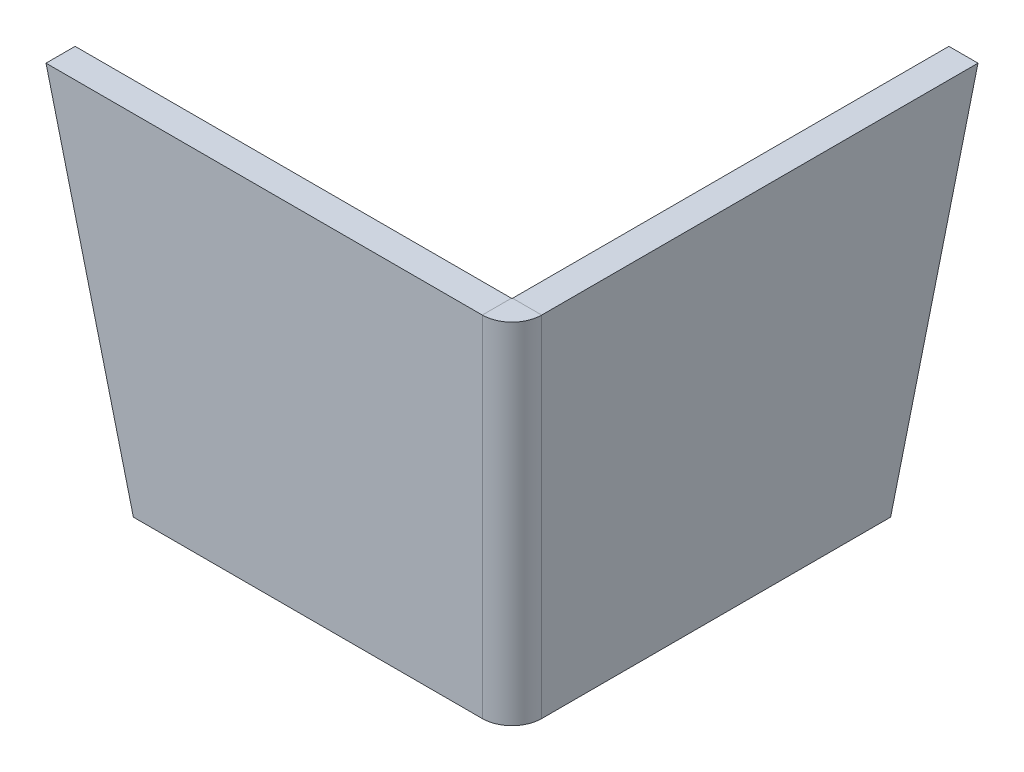
ISO-10303-21;
HEADER;
FILE_DESCRIPTION(('STEP AP214'),'2;1');
FILE_NAME('part.step','',(''),(''),'','','');
FILE_SCHEMA(('AUTOMOTIVE_DESIGN { 1 0 10303 214 1 1 1 1 }'));
ENDSEC;
DATA;
#1=APPLICATION_CONTEXT('core data for automotive mechanical design processes');
#2=APPLICATION_PROTOCOL_DEFINITION('international standard','automotive_design',2000,#1);
#3=PRODUCT_CONTEXT('',#1,'mechanical');
#4=PRODUCT('Part','Part','',(#3));
#5=PRODUCT_RELATED_PRODUCT_CATEGORY('part','',(#4));
#6=PRODUCT_DEFINITION_FORMATION('','',#4);
#7=PRODUCT_DEFINITION_CONTEXT('part definition',#1,'design');
#8=PRODUCT_DEFINITION('design','',#6,#7);
#9=PRODUCT_DEFINITION_SHAPE('','',#8);
#10=(LENGTH_UNIT() NAMED_UNIT(*) SI_UNIT(.MILLI.,.METRE.));
#11=(NAMED_UNIT(*) PLANE_ANGLE_UNIT() SI_UNIT($,.RADIAN.));
#12=(NAMED_UNIT(*) SI_UNIT($,.STERADIAN.) SOLID_ANGLE_UNIT());
#13=UNCERTAINTY_MEASURE_WITH_UNIT(LENGTH_MEASURE(1.E-05),#10,'distance_accuracy_value','');
#14=(GEOMETRIC_REPRESENTATION_CONTEXT(3) GLOBAL_UNCERTAINTY_ASSIGNED_CONTEXT((#13)) GLOBAL_UNIT_ASSIGNED_CONTEXT((#10,
#11,#12)) REPRESENTATION_CONTEXT('',''));
#15=CARTESIAN_POINT('',(0.,0.,0.));
#16=DIRECTION('',(0.,0.,1.));
#17=DIRECTION('',(1.,0.,0.));
#18=AXIS2_PLACEMENT_3D('',#15,#16,#17);
#19=CARTESIAN_POINT('',(-16.937594024725,-1.11022302462516E-13,420.));
#20=DIRECTION('',(0.,0.242535625036334,0.970142500145332));
#21=DIRECTION('',(0.,-0.970142500145336,0.242535625036333));
#22=AXIS2_PLACEMENT_3D('',#19,#20,#21);
#23=PLANE('',#22);
#24=DIRECTION('',(0.,0.970142500145336,-0.242535625036333));
#25=VECTOR('',#24,1.);
#26=CARTESIAN_POINT('',(175.,-60.0000000000004,435.));
#27=LINE('',#26,#25);
#28=CARTESIAN_POINT('',(175.,-60.0000000000004,435.));
#29=VERTEX_POINT('',#28);
#30=CARTESIAN_POINT('',(175.,0.,420.));
#31=VERTEX_POINT('',#30);
#32=EDGE_CURVE('E131',#29,#31,#27,.T.);
#33=ORIENTED_EDGE('',*,*,#32,.F.);
#34=DIRECTION('',(1.,0.,0.));
#35=VECTOR('',#34,1.);
#36=CARTESIAN_POINT('',(-16.9375940247248,-60.0000000000002,435.));
#37=LINE('',#36,#35);
#38=CARTESIAN_POINT('',(170.,-60.0000000000004,435.));
#39=VERTEX_POINT('',#38);
#40=EDGE_CURVE('E254',#39,#29,#37,.T.);
#41=ORIENTED_EDGE('',*,*,#40,.F.);
#42=DIRECTION('',(0.,-0.970142500145336,0.242535625036333));
#43=VECTOR('',#42,1.);
#44=CARTESIAN_POINT('',(170.,-1.11022302462516E-13,420.));
#45=LINE('',#44,#43);
#46=CARTESIAN_POINT('',(170.,-1.11022302462516E-13,420.));
#47=VERTEX_POINT('',#46);
#48=EDGE_CURVE('E12',#47,#39,#45,.T.);
#49=ORIENTED_EDGE('',*,*,#48,.F.);
#50=DIRECTION('',(1.,0.,0.));
#51=VECTOR('',#50,1.);
#52=CARTESIAN_POINT('',(-16.937594024725,0.,420.));
#53=LINE('',#52,#51);
#54=EDGE_CURVE('E146',#47,#31,#53,.T.);
#55=ORIENTED_EDGE('',*,*,#54,.T.);
#56=EDGE_LOOP('',(#33,#41,#49,#55));
#57=FACE_BOUND('',#56,.T.);
#58=ADVANCED_FACE('F47',(#57),#23,.F.);
#59=CARTESIAN_POINT('',(-16.9375940247247,0.,0.));
#60=DIRECTION('',(0.,1.,0.));
#61=DIRECTION('',(1.,0.,0.));
#62=AXIS2_PLACEMENT_3D('',#59,#60,#61);
#63=PLANE('',#62);
#64=DIRECTION('',(1.,0.,0.));
#65=VECTOR('',#64,1.);
#66=CARTESIAN_POINT('',(-16.937594024725,-1.11022302462516E-13,494.9));
#67=LINE('',#66,#65);
#68=CARTESIAN_POINT('',(170.,-1.38777878078145E-13,494.9));
#69=VERTEX_POINT('',#68);
#70=CARTESIAN_POINT('',(174.999999999999,-1.11022302462516E-13,494.9));
#71=VERTEX_POINT('',#70);
#72=EDGE_CURVE('E137',#69,#71,#67,.T.);
#73=ORIENTED_EDGE('',*,*,#72,.T.);
#74=DIRECTION('',(0.,0.,-1.));
#75=VECTOR('',#74,1.);
#76=CARTESIAN_POINT('',(175.,0.,-500.));
#77=LINE('',#76,#75);
#78=EDGE_CURVE('E123',#71,#31,#77,.T.);
#79=ORIENTED_EDGE('',*,*,#78,.T.);
#80=ORIENTED_EDGE('',*,*,#54,.F.);
#81=DIRECTION('',(0.,0.,-1.));
#82=VECTOR('',#81,1.);
#83=CARTESIAN_POINT('',(170.,0.,-2.77555756156289E-13));
#84=LINE('',#83,#82);
#85=EDGE_CURVE('E136',#47,#69,#84,.F.);
#86=ORIENTED_EDGE('',*,*,#85,.T.);
#87=EDGE_LOOP('',(#73,#79,#80,#86));
#88=FACE_BOUND('',#87,.T.);
#89=ADVANCED_FACE('F140',(#88),#63,.T.);
#90=CARTESIAN_POINT('',(175.,1000.,-500.));
#91=DIRECTION('',(1.,0.,0.));
#92=DIRECTION('',(0.,0.,-1.));
#93=AXIS2_PLACEMENT_3D('',#90,#91,#92);
#94=PLANE('',#93);
#95=DIRECTION('',(0.,1.,0.));
#96=VECTOR('',#95,1.);
#97=CARTESIAN_POINT('',(175.,-1.11022302462516E-13,494.9));
#98=LINE('',#97,#96);
#99=CARTESIAN_POINT('',(174.999999999999,-60.0000000000004,494.9));
#100=VERTEX_POINT('',#99);
#101=EDGE_CURVE('E128',#100,#71,#98,.T.);
#102=ORIENTED_EDGE('',*,*,#101,.F.);
#103=DIRECTION('',(0.,0.,-1.));
#104=VECTOR('',#103,1.);
#105=CARTESIAN_POINT('',(175.,-60.0000000000003,0.));
#106=LINE('',#105,#104);
#107=EDGE_CURVE('E249',#100,#29,#106,.T.);
#108=ORIENTED_EDGE('',*,*,#107,.T.);
#109=ORIENTED_EDGE('',*,*,#32,.T.);
#110=ORIENTED_EDGE('',*,*,#78,.F.);
#111=EDGE_LOOP('',(#102,#108,#109,#110));
#112=FACE_BOUND('',#111,.T.);
#113=ADVANCED_FACE('F125',(#112),#94,.T.);
#114=CARTESIAN_POINT('',(-16.9375940247247,-60.0000000000002,-3.33066907387547E-13));
#115=DIRECTION('',(0.,1.,0.));
#116=DIRECTION('',(1.,0.,0.));
#117=AXIS2_PLACEMENT_3D('',#114,#115,#116);
#118=PLANE('',#117);
#119=ORIENTED_EDGE('',*,*,#107,.F.);
#120=DIRECTION('',(1.,0.,0.));
#121=VECTOR('',#120,1.);
#122=CARTESIAN_POINT('',(-16.937594024725,-60.0000000000002,494.9));
#123=LINE('',#122,#121);
#124=CARTESIAN_POINT('',(169.999999999999,-60.0000000000004,494.9));
#125=VERTEX_POINT('',#124);
#126=EDGE_CURVE('E51',#125,#100,#123,.T.);
#127=ORIENTED_EDGE('',*,*,#126,.F.);
#128=DIRECTION('',(0.,0.,1.));
#129=VECTOR('',#128,1.);
#130=CARTESIAN_POINT('',(170.,-60.0000000000004,0.));
#131=LINE('',#130,#129);
#132=EDGE_CURVE('E82',#39,#125,#131,.T.);
#133=ORIENTED_EDGE('',*,*,#132,.F.);
#134=ORIENTED_EDGE('',*,*,#40,.T.);
#135=EDGE_LOOP('',(#119,#127,#133,#134));
#136=FACE_BOUND('',#135,.T.);
#137=ADVANCED_FACE('F267',(#136),#118,.F.);
#138=CARTESIAN_POINT('',(170.,-60.0000000000004,495.));
#139=DIRECTION('',(1.,0.,0.));
#140=DIRECTION('',(0.,0.,-1.));
#141=AXIS2_PLACEMENT_3D('',#138,#139,#140);
#142=PLANE('',#141);
#143=ORIENTED_EDGE('',*,*,#132,.T.);
#144=DIRECTION('',(0.,1.,0.));
#145=VECTOR('',#144,1.);
#146=CARTESIAN_POINT('',(170.,-1.38777878078145E-13,494.9));
#147=LINE('',#146,#145);
#148=EDGE_CURVE('E58',#125,#69,#147,.T.);
#149=ORIENTED_EDGE('',*,*,#148,.T.);
#150=ORIENTED_EDGE('',*,*,#85,.F.);
#151=ORIENTED_EDGE('',*,*,#48,.T.);
#152=EDGE_LOOP('',(#143,#149,#150,#151));
#153=FACE_BOUND('',#152,.T.);
#154=ADVANCED_FACE('F49',(#153),#142,.F.);
#155=CARTESIAN_POINT('',(0.,0.,308.062405975275));
#156=DIRECTION('',(0.,1.,0.));
#157=DIRECTION('',(0.,0.,1.));
#158=AXIS2_PLACEMENT_3D('',#155,#156,#157);
#159=PLANE('',#158);
#160=DIRECTION('',(-1.,0.,0.));
#161=VECTOR('',#160,1.);
#162=CARTESIAN_POINT('',(-175.,0.,500.));
#163=LINE('',#162,#161);
#164=CARTESIAN_POINT('',(169.9,0.,500.));
#165=VERTEX_POINT('',#164);
#166=CARTESIAN_POINT('',(94.9999999999999,-1.11022302462516E-13,500.));
#167=VERTEX_POINT('',#166);
#168=EDGE_CURVE('E92',#165,#167,#163,.T.);
#169=ORIENTED_EDGE('',*,*,#168,.F.);
#170=DIRECTION('',(0.,0.,1.));
#171=VECTOR('',#170,1.);
#172=CARTESIAN_POINT('',(169.9,-1.11022302462516E-13,308.062405975275));
#173=LINE('',#172,#171);
#174=CARTESIAN_POINT('',(169.899999999999,-1.38777878078145E-13,495.));
#175=VERTEX_POINT('',#174);
#176=EDGE_CURVE('E159',#175,#165,#173,.T.);
#177=ORIENTED_EDGE('',*,*,#176,.F.);
#178=DIRECTION('',(1.,0.,0.));
#179=VECTOR('',#178,1.);
#180=CARTESIAN_POINT('',(-2.22044604925031E-13,0.,495.));
#181=LINE('',#180,#179);
#182=CARTESIAN_POINT('',(94.9999999999997,-1.38777878078145E-13,495.));
#183=VERTEX_POINT('',#182);
#184=EDGE_CURVE('E185',#175,#183,#181,.F.);
#185=ORIENTED_EDGE('',*,*,#184,.T.);
#186=DIRECTION('',(0.,0.,1.));
#187=VECTOR('',#186,1.);
#188=CARTESIAN_POINT('',(94.9999999999999,0.,308.062405975275));
#189=LINE('',#188,#187);
#190=EDGE_CURVE('E184',#183,#167,#189,.T.);
#191=ORIENTED_EDGE('',*,*,#190,.T.);
#192=EDGE_LOOP('',(#169,#177,#185,#191));
#193=FACE_BOUND('',#192,.T.);
#194=ADVANCED_FACE('F231',(#193),#159,.T.);
#195=CARTESIAN_POINT('',(0.,-60.0000000000002,308.062405975275));
#196=DIRECTION('',(0.,1.,0.));
#197=DIRECTION('',(0.,0.,1.));
#198=AXIS2_PLACEMENT_3D('',#195,#196,#197);
#199=PLANE('',#198);
#200=DIRECTION('',(0.,0.,1.));
#201=VECTOR('',#200,1.);
#202=CARTESIAN_POINT('',(169.9,-60.0000000000002,308.062405975275));
#203=LINE('',#202,#201);
#204=CARTESIAN_POINT('',(169.9,-60.0000000000004,495.));
#205=VERTEX_POINT('',#204);
#206=CARTESIAN_POINT('',(169.9,-60.0000000000003,500.));
#207=VERTEX_POINT('',#206);
#208=EDGE_CURVE('E100',#205,#207,#203,.T.);
#209=ORIENTED_EDGE('',*,*,#208,.T.);
#210=DIRECTION('',(-1.,0.,0.));
#211=VECTOR('',#210,1.);
#212=CARTESIAN_POINT('',(-175.,-60.0000000000004,500.000000000001));
#213=LINE('',#212,#211);
#214=CARTESIAN_POINT('',(110.,-60.0000000000004,500.));
#215=VERTEX_POINT('',#214);
#216=EDGE_CURVE('E211',#207,#215,#213,.T.);
#217=ORIENTED_EDGE('',*,*,#216,.T.);
#218=DIRECTION('',(0.,0.,1.));
#219=VECTOR('',#218,1.);
#220=CARTESIAN_POINT('',(110.,-60.0000000000002,308.062405975275));
#221=LINE('',#220,#219);
#222=CARTESIAN_POINT('',(110.,-60.0000000000004,495.));
#223=VERTEX_POINT('',#222);
#224=EDGE_CURVE('E188',#223,#215,#221,.T.);
#225=ORIENTED_EDGE('',*,*,#224,.F.);
#226=DIRECTION('',(1.,0.,0.));
#227=VECTOR('',#226,1.);
#228=CARTESIAN_POINT('',(-2.22044604925031E-13,-60.0000000000004,495.));
#229=LINE('',#228,#227);
#230=EDGE_CURVE('E219',#205,#223,#229,.F.);
#231=ORIENTED_EDGE('',*,*,#230,.F.);
#232=EDGE_LOOP('',(#209,#217,#225,#231));
#233=FACE_BOUND('',#232,.T.);
#234=ADVANCED_FACE('F235',(#233),#199,.F.);
#235=CARTESIAN_POINT('',(94.9999999999999,0.,308.062405975275));
#236=DIRECTION('',(-0.970142500145332,-0.242535625036334,0.));
#237=DIRECTION('',(0.242535625036333,-0.970142500145336,0.));
#238=AXIS2_PLACEMENT_3D('',#235,#236,#237);
#239=PLANE('',#238);
#240=DIRECTION('',(-0.242535625036333,0.970142500145336,0.));
#241=VECTOR('',#240,1.);
#242=CARTESIAN_POINT('',(110.,-60.0000000000004,500.));
#243=LINE('',#242,#241);
#244=EDGE_CURVE('E207',#215,#167,#243,.T.);
#245=ORIENTED_EDGE('',*,*,#244,.T.);
#246=ORIENTED_EDGE('',*,*,#190,.F.);
#247=DIRECTION('',(0.242535625036333,-0.970142500145336,0.));
#248=VECTOR('',#247,1.);
#249=CARTESIAN_POINT('',(94.9999999999997,-1.38777878078145E-13,495.));
#250=LINE('',#249,#248);
#251=EDGE_CURVE('E222',#183,#223,#250,.T.);
#252=ORIENTED_EDGE('',*,*,#251,.T.);
#253=ORIENTED_EDGE('',*,*,#224,.T.);
#254=EDGE_LOOP('',(#245,#246,#252,#253));
#255=FACE_BOUND('',#254,.T.);
#256=ADVANCED_FACE('F237',(#255),#239,.T.);
#257=CARTESIAN_POINT('',(170.,-60.0000000000004,495.));
#258=DIRECTION('',(0.,0.,1.));
#259=DIRECTION('',(1.,0.,0.));
#260=AXIS2_PLACEMENT_3D('',#257,#258,#259);
#261=PLANE('',#260);
#262=DIRECTION('',(0.,1.,0.));
#263=VECTOR('',#262,1.);
#264=CARTESIAN_POINT('',(169.899999999999,-1.38777878078145E-13,495.));
#265=LINE('',#264,#263);
#266=EDGE_CURVE('E178',#205,#175,#265,.T.);
#267=ORIENTED_EDGE('',*,*,#266,.F.);
#268=ORIENTED_EDGE('',*,*,#230,.T.);
#269=ORIENTED_EDGE('',*,*,#251,.F.);
#270=ORIENTED_EDGE('',*,*,#184,.F.);
#271=EDGE_LOOP('',(#267,#268,#269,#270));
#272=FACE_BOUND('',#271,.T.);
#273=ADVANCED_FACE('F234',(#272),#261,.F.);
#274=CARTESIAN_POINT('',(-175.,1000.,500.));
#275=DIRECTION('',(0.,0.,-1.));
#276=DIRECTION('',(-1.,0.,0.));
#277=AXIS2_PLACEMENT_3D('',#274,#275,#276);
#278=PLANE('',#277);
#279=DIRECTION('',(0.,-1.,0.));
#280=VECTOR('',#279,1.);
#281=CARTESIAN_POINT('',(169.9,0.,500.));
#282=LINE('',#281,#280);
#283=EDGE_CURVE('E215',#165,#207,#282,.T.);
#284=ORIENTED_EDGE('',*,*,#283,.F.);
#285=ORIENTED_EDGE('',*,*,#168,.T.);
#286=ORIENTED_EDGE('',*,*,#244,.F.);
#287=ORIENTED_EDGE('',*,*,#216,.F.);
#288=EDGE_LOOP('',(#284,#285,#286,#287));
#289=FACE_BOUND('',#288,.T.);
#290=ADVANCED_FACE('F239',(#289),#278,.F.);
#291=CARTESIAN_POINT('',(169.899999999999,-1.38777878078145E-13,494.9));
#292=DIRECTION('',(0.,1.,0.));
#293=DIRECTION('',(0.,0.,1.));
#294=AXIS2_PLACEMENT_3D('',#291,#292,#293);
#295=PLANE('',#294);
#296=ORIENTED_EDGE('',*,*,#72,.F.);
#297=CARTESIAN_POINT('',(169.899999999999,-1.38777878078145E-13,494.9));
#298=DIRECTION('',(0.,-1.,0.));
#299=DIRECTION('',(0.,0.,-1.));
#300=AXIS2_PLACEMENT_3D('',#297,#298,#299);
#301=CIRCLE('',#300,0.100000000000018);
#302=EDGE_CURVE('E167',#69,#175,#301,.T.);
#303=ORIENTED_EDGE('',*,*,#302,.T.);
#304=ORIENTED_EDGE('',*,*,#176,.T.);
#305=CARTESIAN_POINT('',(169.899999999999,-1.38777878078145E-13,494.9));
#306=DIRECTION('',(0.,-1.,0.));
#307=DIRECTION('',(0.,0.,-1.));
#308=AXIS2_PLACEMENT_3D('',#305,#306,#307);
#309=CIRCLE('',#308,5.09999999999997);
#310=EDGE_CURVE('E153',#71,#165,#309,.T.);
#311=ORIENTED_EDGE('',*,*,#310,.F.);
#312=EDGE_LOOP('',(#296,#303,#304,#311));
#313=FACE_BOUND('',#312,.T.);
#314=ADVANCED_FACE('F158',(#313),#295,.T.);
#315=CARTESIAN_POINT('',(169.9,-60.0000000000004,494.9));
#316=DIRECTION('',(0.,-1.,0.));
#317=DIRECTION('',(0.,0.,-1.));
#318=AXIS2_PLACEMENT_3D('',#315,#316,#317);
#319=PLANE('',#318);
#320=CARTESIAN_POINT('',(169.9,-60.0000000000004,494.9));
#321=DIRECTION('',(0.,-1.,0.));
#322=DIRECTION('',(0.,0.,-1.));
#323=AXIS2_PLACEMENT_3D('',#320,#321,#322);
#324=CIRCLE('',#323,0.100000000000018);
#325=EDGE_CURVE('E161',#205,#125,#324,.F.);
#326=ORIENTED_EDGE('',*,*,#325,.T.);
#327=ORIENTED_EDGE('',*,*,#126,.T.);
#328=CARTESIAN_POINT('',(169.9,-60.0000000000004,494.9));
#329=DIRECTION('',(0.,-1.,0.));
#330=DIRECTION('',(0.,0.,-1.));
#331=AXIS2_PLACEMENT_3D('',#328,#329,#330);
#332=CIRCLE('',#331,5.09999999999997);
#333=EDGE_CURVE('E155',#207,#100,#332,.F.);
#334=ORIENTED_EDGE('',*,*,#333,.F.);
#335=ORIENTED_EDGE('',*,*,#208,.F.);
#336=EDGE_LOOP('',(#326,#327,#334,#335));
#337=FACE_BOUND('',#336,.T.);
#338=ADVANCED_FACE('F241',(#337),#319,.T.);
#339=CARTESIAN_POINT('',(169.9,163.490060859981,494.9));
#340=DIRECTION('',(0.,-1.,0.));
#341=DIRECTION('',(0.,0.,-1.));
#342=AXIS2_PLACEMENT_3D('',#339,#340,#341);
#343=CYLINDRICAL_SURFACE('',#342,5.09999999999997);
#344=ORIENTED_EDGE('',*,*,#283,.T.);
#345=ORIENTED_EDGE('',*,*,#333,.T.);
#346=ORIENTED_EDGE('',*,*,#101,.T.);
#347=ORIENTED_EDGE('',*,*,#310,.T.);
#348=EDGE_LOOP('',(#344,#345,#346,#347));
#349=FACE_BOUND('',#348,.T.);
#350=ADVANCED_FACE('F152',(#349),#343,.T.);
#351=CARTESIAN_POINT('',(169.9,163.490060859981,494.9));
#352=DIRECTION('',(0.,-1.,0.));
#353=DIRECTION('',(0.,0.,-1.));
#354=AXIS2_PLACEMENT_3D('',#351,#352,#353);
#355=CYLINDRICAL_SURFACE('',#354,0.100000000000018);
#356=ORIENTED_EDGE('',*,*,#266,.T.);
#357=ORIENTED_EDGE('',*,*,#302,.F.);
#358=ORIENTED_EDGE('',*,*,#148,.F.);
#359=ORIENTED_EDGE('',*,*,#325,.F.);
#360=EDGE_LOOP('',(#356,#357,#358,#359));
#361=FACE_BOUND('',#360,.T.);
#362=ADVANCED_FACE('F302',(#361),#355,.F.);
#363=CLOSED_SHELL('',(#58,#89,#113,#137,#154,#194,#234,#256,#273,#290,#314,#338,#350,#362));
#364=MANIFOLD_SOLID_BREP('B2',#363);
#365=ADVANCED_BREP_SHAPE_REPRESENTATION('',(#18,#364),#14);
#366=SHAPE_DEFINITION_REPRESENTATION(#9,#365);
ENDSEC;
END-ISO-10303-21;
